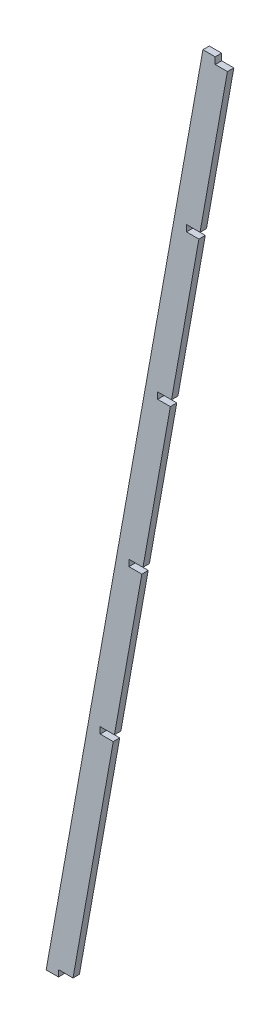
ISO-10303-21;
HEADER;
FILE_DESCRIPTION(('STEP AP214'),'2;1');
FILE_NAME('part.step','',(''),(''),'','','');
FILE_SCHEMA(('AUTOMOTIVE_DESIGN { 1 0 10303 214 1 1 1 1 }'));
ENDSEC;
DATA;
#1=APPLICATION_CONTEXT('core data for automotive mechanical design processes');
#2=APPLICATION_PROTOCOL_DEFINITION('international standard','automotive_design',2000,#1);
#3=PRODUCT_CONTEXT('',#1,'mechanical');
#4=PRODUCT('Part','Part','',(#3));
#5=PRODUCT_RELATED_PRODUCT_CATEGORY('part','',(#4));
#6=PRODUCT_DEFINITION_FORMATION('','',#4);
#7=PRODUCT_DEFINITION_CONTEXT('part definition',#1,'design');
#8=PRODUCT_DEFINITION('design','',#6,#7);
#9=PRODUCT_DEFINITION_SHAPE('','',#8);
#10=(LENGTH_UNIT() NAMED_UNIT(*) SI_UNIT(.MILLI.,.METRE.));
#11=(NAMED_UNIT(*) PLANE_ANGLE_UNIT() SI_UNIT($,.RADIAN.));
#12=(NAMED_UNIT(*) SI_UNIT($,.STERADIAN.) SOLID_ANGLE_UNIT());
#13=UNCERTAINTY_MEASURE_WITH_UNIT(LENGTH_MEASURE(1.E-05),#10,'distance_accuracy_value','');
#14=(GEOMETRIC_REPRESENTATION_CONTEXT(3) GLOBAL_UNCERTAINTY_ASSIGNED_CONTEXT((#13)) GLOBAL_UNIT_ASSIGNED_CONTEXT((#10,
#11,#12)) REPRESENTATION_CONTEXT('',''));
#15=CARTESIAN_POINT('',(0.,0.,0.));
#16=DIRECTION('',(0.,0.,1.));
#17=DIRECTION('',(1.,0.,0.));
#18=AXIS2_PLACEMENT_3D('',#15,#16,#17);
#19=CARTESIAN_POINT('',(12.3053039956114,-2.20382719827451,0.));
#20=DIRECTION('',(-0.984338140304232,0.17629074151074,0.));
#21=DIRECTION('',(-0.17629074151074,-0.984338140304232,0.));
#22=AXIS2_PLACEMENT_3D('',#19,#20,#21);
#23=PLANE('',#22);
#24=DIRECTION('',(0.17629074151074,0.984338140304232,0.));
#25=VECTOR('',#24,1.);
#26=CARTESIAN_POINT('',(12.7,0.,0.));
#27=LINE('',#26,#25);
#28=CARTESIAN_POINT('',(47.8412654139753,196.215,0.));
#29=VERTEX_POINT('',#28);
#30=CARTESIAN_POINT('',(61.3746330005872,271.78,0.));
#31=VERTEX_POINT('',#30);
#32=EDGE_CURVE('E404',#29,#31,#27,.T.);
#33=ORIENTED_EDGE('',*,*,#32,.F.);
#34=DIRECTION('',(0.,0.,1.));
#35=VECTOR('',#34,1.);
#36=CARTESIAN_POINT('',(47.8412654139753,196.215,-5.08));
#37=LINE('',#36,#35);
#38=CARTESIAN_POINT('',(47.8412654139753,196.215,-3.175));
#39=VERTEX_POINT('',#38);
#40=EDGE_CURVE('E631',#39,#29,#37,.T.);
#41=ORIENTED_EDGE('',*,*,#40,.F.);
#42=DIRECTION('',(0.17629074151074,0.984338140304232,0.));
#43=VECTOR('',#42,1.);
#44=CARTESIAN_POINT('',(12.7,0.,-3.175));
#45=LINE('',#44,#43);
#46=CARTESIAN_POINT('',(61.3746330005872,271.78,-3.175));
#47=VERTEX_POINT('',#46);
#48=EDGE_CURVE('E427',#39,#47,#45,.T.);
#49=ORIENTED_EDGE('',*,*,#48,.T.);
#50=DIRECTION('',(0.,0.,1.));
#51=VECTOR('',#50,1.);
#52=CARTESIAN_POINT('',(61.3746330005872,271.78,-5.08));
#53=LINE('',#52,#51);
#54=EDGE_CURVE('E562',#47,#31,#53,.T.);
#55=ORIENTED_EDGE('',*,*,#54,.T.);
#56=EDGE_LOOP('',(#33,#41,#49,#55));
#57=FACE_BOUND('',#56,.T.);
#58=ADVANCED_FACE('F48',(#57),#23,.F.);
#59=CARTESIAN_POINT('',(33.7392689371697,117.475,-3.175));
#60=VERTEX_POINT('',#59);
#61=CARTESIAN_POINT('',(47.2726365237816,193.04,-3.175));
#62=VERTEX_POINT('',#61);
#63=EDGE_CURVE('E419',#60,#62,#45,.T.);
#64=ORIENTED_EDGE('',*,*,#63,.T.);
#65=DIRECTION('',(0.,0.,1.));
#66=VECTOR('',#65,1.);
#67=CARTESIAN_POINT('',(47.2726365237816,193.04,-5.08));
#68=LINE('',#67,#66);
#69=CARTESIAN_POINT('',(47.2726365237816,193.04,0.));
#70=VERTEX_POINT('',#69);
#71=EDGE_CURVE('E655',#62,#70,#68,.T.);
#72=ORIENTED_EDGE('',*,*,#71,.T.);
#73=CARTESIAN_POINT('',(33.7392689371697,117.475,0.));
#74=VERTEX_POINT('',#73);
#75=EDGE_CURVE('E388',#74,#70,#27,.T.);
#76=ORIENTED_EDGE('',*,*,#75,.F.);
#77=DIRECTION('',(0.,0.,1.));
#78=VECTOR('',#77,1.);
#79=CARTESIAN_POINT('',(33.7392689371697,117.475,-5.08));
#80=LINE('',#79,#78);
#81=EDGE_CURVE('E583',#60,#74,#80,.T.);
#82=ORIENTED_EDGE('',*,*,#81,.F.);
#83=EDGE_LOOP('',(#64,#72,#76,#82));
#84=FACE_BOUND('',#83,.T.);
#85=ADVANCED_FACE('F532',(#84),#23,.F.);
#86=CARTESIAN_POINT('',(61.943261890781,274.955,0.));
#87=VERTEX_POINT('',#86);
#88=CARTESIAN_POINT('',(75.4766294773928,350.52,0.));
#89=VERTEX_POINT('',#88);
#90=EDGE_CURVE('E407',#87,#89,#27,.T.);
#91=ORIENTED_EDGE('',*,*,#90,.F.);
#92=DIRECTION('',(0.,0.,1.));
#93=VECTOR('',#92,1.);
#94=CARTESIAN_POINT('',(61.943261890781,274.955,-5.08));
#95=LINE('',#94,#93);
#96=CARTESIAN_POINT('',(61.943261890781,274.955,-3.175));
#97=VERTEX_POINT('',#96);
#98=EDGE_CURVE('E589',#97,#87,#95,.T.);
#99=ORIENTED_EDGE('',*,*,#98,.F.);
#100=CARTESIAN_POINT('',(75.4766294773928,350.52,-3.175));
#101=VERTEX_POINT('',#100);
#102=EDGE_CURVE('E436',#97,#101,#45,.T.);
#103=ORIENTED_EDGE('',*,*,#102,.T.);
#104=DIRECTION('',(0.,0.,1.));
#105=VECTOR('',#104,1.);
#106=CARTESIAN_POINT('',(75.4766294773928,350.52,-5.08));
#107=LINE('',#106,#105);
#108=EDGE_CURVE('E602',#101,#89,#107,.T.);
#109=ORIENTED_EDGE('',*,*,#108,.T.);
#110=EDGE_LOOP('',(#91,#99,#103,#109));
#111=FACE_BOUND('',#110,.T.);
#112=ADVANCED_FACE('F537',(#111),#23,.F.);
#113=CARTESIAN_POINT('',(13.2686288901938,3.17500000000003,0.));
#114=VERTEX_POINT('',#113);
#115=CARTESIAN_POINT('',(33.1706400469759,114.3,0.));
#116=VERTEX_POINT('',#115);
#117=EDGE_CURVE('E382',#114,#116,#27,.T.);
#118=ORIENTED_EDGE('',*,*,#117,.F.);
#119=DIRECTION('',(0.,0.,1.));
#120=VECTOR('',#119,1.);
#121=CARTESIAN_POINT('',(13.2686288901938,3.17500000000003,-5.08));
#122=LINE('',#121,#120);
#123=CARTESIAN_POINT('',(13.2686288901938,3.17500000000003,-3.175));
#124=VERTEX_POINT('',#123);
#125=EDGE_CURVE('E232',#124,#114,#122,.T.);
#126=ORIENTED_EDGE('',*,*,#125,.F.);
#127=CARTESIAN_POINT('',(33.1706400469759,114.3,-3.175));
#128=VERTEX_POINT('',#127);
#129=EDGE_CURVE('E414',#124,#128,#45,.T.);
#130=ORIENTED_EDGE('',*,*,#129,.T.);
#131=DIRECTION('',(0.,0.,1.));
#132=VECTOR('',#131,1.);
#133=CARTESIAN_POINT('',(33.1706400469759,114.3,-5.08));
#134=LINE('',#133,#132);
#135=EDGE_CURVE('E551',#128,#116,#134,.T.);
#136=ORIENTED_EDGE('',*,*,#135,.T.);
#137=EDGE_LOOP('',(#118,#126,#130,#136));
#138=FACE_BOUND('',#137,.T.);
#139=ADVANCED_FACE('F541',(#138),#23,.F.);
#140=CARTESIAN_POINT('',(0.,432.562,0.));
#141=DIRECTION('',(0.,-1.,0.));
#142=DIRECTION('',(0.,0.,-1.));
#143=AXIS2_PLACEMENT_3D('',#140,#141,#142);
#144=PLANE('',#143);
#145=DIRECTION('',(1.,0.,0.));
#146=VECTOR('',#145,1.);
#147=CARTESIAN_POINT('',(77.47,432.562,0.));
#148=LINE('',#147,#146);
#149=CARTESIAN_POINT('',(77.47,432.562,0.));
#150=VERTEX_POINT('',#149);
#151=CARTESIAN_POINT('',(83.5418181672285,432.562,0.));
#152=VERTEX_POINT('',#151);
#153=EDGE_CURVE('E53',#150,#152,#148,.T.);
#154=ORIENTED_EDGE('',*,*,#153,.T.);
#155=DIRECTION('',(0.,0.,1.));
#156=VECTOR('',#155,1.);
#157=CARTESIAN_POINT('',(83.5418181672285,432.562,-5.08));
#158=LINE('',#157,#156);
#159=CARTESIAN_POINT('',(83.5418181672285,432.562,-3.175));
#160=VERTEX_POINT('',#159);
#161=EDGE_CURVE('E212',#160,#152,#158,.T.);
#162=ORIENTED_EDGE('',*,*,#161,.F.);
#163=DIRECTION('',(-1.,0.,0.));
#164=VECTOR('',#163,1.);
#165=CARTESIAN_POINT('',(77.47,432.562,-3.175));
#166=LINE('',#165,#164);
#167=CARTESIAN_POINT('',(77.47,432.562,-3.175));
#168=VERTEX_POINT('',#167);
#169=EDGE_CURVE('E240',#160,#168,#166,.T.);
#170=ORIENTED_EDGE('',*,*,#169,.T.);
#171=DIRECTION('',(0.,0.,1.));
#172=VECTOR('',#171,1.);
#173=CARTESIAN_POINT('',(77.47,432.562,0.));
#174=LINE('',#173,#172);
#175=EDGE_CURVE('E236',#168,#150,#174,.T.);
#176=ORIENTED_EDGE('',*,*,#175,.T.);
#177=EDGE_LOOP('',(#154,#162,#170,#176));
#178=FACE_BOUND('',#177,.T.);
#179=ADVANCED_FACE('F50',(#178),#144,.F.);
#180=CARTESIAN_POINT('',(0.,0.,0.));
#181=DIRECTION('',(0.,-1.,0.));
#182=DIRECTION('',(0.,0.,-1.));
#183=AXIS2_PLACEMENT_3D('',#180,#181,#182);
#184=PLANE('',#183);
#185=DIRECTION('',(0.,0.,1.));
#186=VECTOR('',#185,1.);
#187=CARTESIAN_POINT('',(6.07181816722854,0.,-5.08));
#188=LINE('',#187,#186);
#189=CARTESIAN_POINT('',(6.07181816722854,0.,-3.175));
#190=VERTEX_POINT('',#189);
#191=CARTESIAN_POINT('',(6.07181816722854,0.,0.));
#192=VERTEX_POINT('',#191);
#193=EDGE_CURVE('E464',#190,#192,#188,.T.);
#194=ORIENTED_EDGE('',*,*,#193,.T.);
#195=DIRECTION('',(1.,0.,0.));
#196=VECTOR('',#195,1.);
#197=CARTESIAN_POINT('',(0.,0.,0.));
#198=LINE('',#197,#196);
#199=CARTESIAN_POINT('',(0.,0.,0.));
#200=VERTEX_POINT('',#199);
#201=EDGE_CURVE('E260',#200,#192,#198,.T.);
#202=ORIENTED_EDGE('',*,*,#201,.F.);
#203=DIRECTION('',(0.,0.,1.));
#204=VECTOR('',#203,1.);
#205=CARTESIAN_POINT('',(0.,0.,0.));
#206=LINE('',#205,#204);
#207=CARTESIAN_POINT('',(0.,0.,-3.175));
#208=VERTEX_POINT('',#207);
#209=EDGE_CURVE('E285',#208,#200,#206,.T.);
#210=ORIENTED_EDGE('',*,*,#209,.F.);
#211=DIRECTION('',(-1.,0.,0.));
#212=VECTOR('',#211,1.);
#213=CARTESIAN_POINT('',(0.,0.,-3.175));
#214=LINE('',#213,#212);
#215=EDGE_CURVE('E267',#190,#208,#214,.T.);
#216=ORIENTED_EDGE('',*,*,#215,.F.);
#217=EDGE_LOOP('',(#194,#202,#210,#216));
#218=FACE_BOUND('',#217,.T.);
#219=ADVANCED_FACE('F287',(#218),#184,.T.);
#220=CARTESIAN_POINT('',(76.0452583675866,353.695,-3.175));
#221=VERTEX_POINT('',#220);
#222=CARTESIAN_POINT('',(89.5786259541985,429.26,-3.175));
#223=VERTEX_POINT('',#222);
#224=EDGE_CURVE('E266',#221,#223,#45,.T.);
#225=ORIENTED_EDGE('',*,*,#224,.T.);
#226=DIRECTION('',(0.,0.,1.));
#227=VECTOR('',#226,1.);
#228=CARTESIAN_POINT('',(89.5786259541985,429.26,-5.08));
#229=LINE('',#228,#227);
#230=CARTESIAN_POINT('',(89.5786259541985,429.26,0.));
#231=VERTEX_POINT('',#230);
#232=EDGE_CURVE('E445',#223,#231,#229,.T.);
#233=ORIENTED_EDGE('',*,*,#232,.T.);
#234=CARTESIAN_POINT('',(76.0452583675866,353.695,0.));
#235=VERTEX_POINT('',#234);
#236=EDGE_CURVE('E399',#235,#231,#27,.T.);
#237=ORIENTED_EDGE('',*,*,#236,.F.);
#238=DIRECTION('',(0.,0.,1.));
#239=VECTOR('',#238,1.);
#240=CARTESIAN_POINT('',(76.0452583675866,353.695,-5.08));
#241=LINE('',#240,#239);
#242=EDGE_CURVE('E446',#221,#235,#241,.T.);
#243=ORIENTED_EDGE('',*,*,#242,.F.);
#244=EDGE_LOOP('',(#225,#233,#237,#243));
#245=FACE_BOUND('',#244,.T.);
#246=ADVANCED_FACE('F297',(#245),#23,.F.);
#247=CARTESIAN_POINT('',(0.,0.,0.));
#248=DIRECTION('',(0.,0.,-1.));
#249=DIRECTION('',(-1.,0.,0.));
#250=AXIS2_PLACEMENT_3D('',#247,#248,#249);
#251=PLANE('',#250);
#252=ORIENTED_EDGE('',*,*,#236,.T.);
#253=DIRECTION('',(1.,0.,0.));
#254=VECTOR('',#253,1.);
#255=CARTESIAN_POINT('',(89.5786259541985,429.26,0.));
#256=LINE('',#255,#254);
#257=CARTESIAN_POINT('',(83.5418181672285,429.26,0.));
#258=VERTEX_POINT('',#257);
#259=EDGE_CURVE('E222',#258,#231,#256,.T.);
#260=ORIENTED_EDGE('',*,*,#259,.F.);
#261=DIRECTION('',(0.,-1.,0.));
#262=VECTOR('',#261,1.);
#263=CARTESIAN_POINT('',(83.5418181672285,432.562,0.));
#264=LINE('',#263,#262);
#265=EDGE_CURVE('E215',#152,#258,#264,.T.);
#266=ORIENTED_EDGE('',*,*,#265,.F.);
#267=ORIENTED_EDGE('',*,*,#153,.F.);
#268=DIRECTION('',(0.17629074151074,0.984338140304232,0.));
#269=VECTOR('',#268,1.);
#270=CARTESIAN_POINT('',(0.,0.,0.));
#271=LINE('',#270,#269);
#272=EDGE_CURVE('E471',#200,#150,#271,.T.);
#273=ORIENTED_EDGE('',*,*,#272,.F.);
#274=ORIENTED_EDGE('',*,*,#201,.T.);
#275=DIRECTION('',(0.,-1.,0.));
#276=VECTOR('',#275,1.);
#277=CARTESIAN_POINT('',(6.07181816722855,3.17500000000003,0.));
#278=LINE('',#277,#276);
#279=CARTESIAN_POINT('',(6.07181816722855,3.17500000000003,0.));
#280=VERTEX_POINT('',#279);
#281=EDGE_CURVE('E558',#280,#192,#278,.T.);
#282=ORIENTED_EDGE('',*,*,#281,.F.);
#283=DIRECTION('',(-1.,0.,0.));
#284=VECTOR('',#283,1.);
#285=CARTESIAN_POINT('',(13.2686288901938,3.17500000000003,0.));
#286=LINE('',#285,#284);
#287=EDGE_CURVE('E557',#114,#280,#286,.T.);
#288=ORIENTED_EDGE('',*,*,#287,.F.);
#289=ORIENTED_EDGE('',*,*,#117,.T.);
#290=DIRECTION('',(1.,0.,0.));
#291=VECTOR('',#290,1.);
#292=CARTESIAN_POINT('',(26.6999246761043,114.3,0.));
#293=LINE('',#292,#291);
#294=CARTESIAN_POINT('',(26.6999246761043,114.3,0.));
#295=VERTEX_POINT('',#294);
#296=EDGE_CURVE('E555',#295,#116,#293,.T.);
#297=ORIENTED_EDGE('',*,*,#296,.F.);
#298=DIRECTION('',(0.,-1.,0.));
#299=VECTOR('',#298,1.);
#300=CARTESIAN_POINT('',(26.6999246761043,117.475,0.));
#301=LINE('',#300,#299);
#302=CARTESIAN_POINT('',(26.6999246761043,117.475,0.));
#303=VERTEX_POINT('',#302);
#304=EDGE_CURVE('E610',#303,#295,#301,.T.);
#305=ORIENTED_EDGE('',*,*,#304,.F.);
#306=DIRECTION('',(-1.,0.,0.));
#307=VECTOR('',#306,1.);
#308=CARTESIAN_POINT('',(33.7392689371697,117.475,0.));
#309=LINE('',#308,#307);
#310=EDGE_CURVE('E604',#74,#303,#309,.T.);
#311=ORIENTED_EDGE('',*,*,#310,.F.);
#312=ORIENTED_EDGE('',*,*,#75,.T.);
#313=DIRECTION('',(1.,0.,0.));
#314=VECTOR('',#313,1.);
#315=CARTESIAN_POINT('',(47.2726365237816,193.04,0.));
#316=LINE('',#315,#314);
#317=CARTESIAN_POINT('',(40.9103980488854,193.04,0.));
#318=VERTEX_POINT('',#317);
#319=EDGE_CURVE('E652',#318,#70,#316,.T.);
#320=ORIENTED_EDGE('',*,*,#319,.F.);
#321=DIRECTION('',(0.,-1.,0.));
#322=VECTOR('',#321,1.);
#323=CARTESIAN_POINT('',(40.9103980488854,193.04,0.));
#324=LINE('',#323,#322);
#325=CARTESIAN_POINT('',(40.9103980488854,196.215,0.));
#326=VERTEX_POINT('',#325);
#327=EDGE_CURVE('E662',#326,#318,#324,.T.);
#328=ORIENTED_EDGE('',*,*,#327,.F.);
#329=DIRECTION('',(-1.,0.,0.));
#330=VECTOR('',#329,1.);
#331=CARTESIAN_POINT('',(40.9103980488854,196.215,0.));
#332=LINE('',#331,#330);
#333=EDGE_CURVE('E460',#29,#326,#332,.T.);
#334=ORIENTED_EDGE('',*,*,#333,.F.);
#335=ORIENTED_EDGE('',*,*,#32,.T.);
#336=DIRECTION('',(1.,0.,0.));
#337=VECTOR('',#336,1.);
#338=CARTESIAN_POINT('',(55.1208714216664,271.78,0.));
#339=LINE('',#338,#337);
#340=CARTESIAN_POINT('',(55.1208714216664,271.78,0.));
#341=VERTEX_POINT('',#340);
#342=EDGE_CURVE('E587',#341,#31,#339,.T.);
#343=ORIENTED_EDGE('',*,*,#342,.F.);
#344=DIRECTION('',(0.,-1.,0.));
#345=VECTOR('',#344,1.);
#346=CARTESIAN_POINT('',(55.1208714216664,274.955,0.));
#347=LINE('',#346,#345);
#348=CARTESIAN_POINT('',(55.1208714216664,274.955,0.));
#349=VERTEX_POINT('',#348);
#350=EDGE_CURVE('E582',#349,#341,#347,.T.);
#351=ORIENTED_EDGE('',*,*,#350,.F.);
#352=DIRECTION('',(-1.,0.,0.));
#353=VECTOR('',#352,1.);
#354=CARTESIAN_POINT('',(61.943261890781,274.955,0.));
#355=LINE('',#354,#353);
#356=EDGE_CURVE('E578',#87,#349,#355,.T.);
#357=ORIENTED_EDGE('',*,*,#356,.F.);
#358=ORIENTED_EDGE('',*,*,#90,.T.);
#359=DIRECTION('',(1.,0.,0.));
#360=VECTOR('',#359,1.);
#361=CARTESIAN_POINT('',(69.3313447944475,350.52,0.));
#362=LINE('',#361,#360);
#363=CARTESIAN_POINT('',(69.3313447944475,350.52,0.));
#364=VERTEX_POINT('',#363);
#365=EDGE_CURVE('E615',#364,#89,#362,.T.);
#366=ORIENTED_EDGE('',*,*,#365,.F.);
#367=DIRECTION('',(0.,-1.,0.));
#368=VECTOR('',#367,1.);
#369=CARTESIAN_POINT('',(69.3313447944475,353.695,0.));
#370=LINE('',#369,#368);
#371=CARTESIAN_POINT('',(69.3313447944475,353.695,0.));
#372=VERTEX_POINT('',#371);
#373=EDGE_CURVE('E625',#372,#364,#370,.T.);
#374=ORIENTED_EDGE('',*,*,#373,.F.);
#375=DIRECTION('',(-1.,0.,0.));
#376=VECTOR('',#375,1.);
#377=CARTESIAN_POINT('',(69.3313447944475,353.695,0.));
#378=LINE('',#377,#376);
#379=EDGE_CURVE('E627',#235,#372,#378,.T.);
#380=ORIENTED_EDGE('',*,*,#379,.F.);
#381=EDGE_LOOP('',(#252,#260,#266,#267,#273,#274,#282,#288,#289,#297,#305,#311,#312,#320,#328,
#334,#335,#343,#351,#357,#358,#366,#374,#380));
#382=FACE_BOUND('',#381,.T.);
#383=ADVANCED_FACE('F227',(#382),#251,.F.);
#384=CARTESIAN_POINT('',(0.,0.,-3.175));
#385=DIRECTION('',(0.,0.,1.));
#386=DIRECTION('',(1.,0.,0.));
#387=AXIS2_PLACEMENT_3D('',#384,#385,#386);
#388=PLANE('',#387);
#389=DIRECTION('',(0.,-1.,0.));
#390=VECTOR('',#389,1.);
#391=CARTESIAN_POINT('',(83.5418181672267,-3.51113151303392E-13,-3.175));
#392=LINE('',#391,#390);
#393=CARTESIAN_POINT('',(83.5418181672285,429.26,-3.175));
#394=VERTEX_POINT('',#393);
#395=EDGE_CURVE('E60',#160,#394,#392,.T.);
#396=ORIENTED_EDGE('',*,*,#395,.T.);
#397=DIRECTION('',(1.,0.,0.));
#398=VECTOR('',#397,1.);
#399=CARTESIAN_POINT('',(0.,429.26,-3.175));
#400=LINE('',#399,#398);
#401=EDGE_CURVE('E12',#394,#223,#400,.T.);
#402=ORIENTED_EDGE('',*,*,#401,.T.);
#403=ORIENTED_EDGE('',*,*,#224,.F.);
#404=DIRECTION('',(-1.,0.,0.));
#405=VECTOR('',#404,1.);
#406=CARTESIAN_POINT('',(2.92437732789578E-12,353.695000000001,-3.175));
#407=LINE('',#406,#405);
#408=CARTESIAN_POINT('',(69.3313447944475,353.695,-3.175));
#409=VERTEX_POINT('',#408);
#410=EDGE_CURVE('E239',#221,#409,#407,.T.);
#411=ORIENTED_EDGE('',*,*,#410,.T.);
#412=DIRECTION('',(0.,-1.,0.));
#413=VECTOR('',#412,1.);
#414=CARTESIAN_POINT('',(69.331344794446,-3.03044312279606E-13,-3.175));
#415=LINE('',#414,#413);
#416=CARTESIAN_POINT('',(69.3313447944475,350.52,-3.175));
#417=VERTEX_POINT('',#416);
#418=EDGE_CURVE('E324',#409,#417,#415,.T.);
#419=ORIENTED_EDGE('',*,*,#418,.T.);
#420=DIRECTION('',(1.,0.,0.));
#421=VECTOR('',#420,1.);
#422=CARTESIAN_POINT('',(0.,350.52,-3.175));
#423=LINE('',#422,#421);
#424=EDGE_CURVE('E328',#417,#101,#423,.T.);
#425=ORIENTED_EDGE('',*,*,#424,.T.);
#426=ORIENTED_EDGE('',*,*,#102,.F.);
#427=DIRECTION('',(-1.,0.,0.));
#428=VECTOR('',#427,1.);
#429=CARTESIAN_POINT('',(2.23720243745759E-12,274.955,-3.175));
#430=LINE('',#429,#428);
#431=CARTESIAN_POINT('',(55.1208714216664,274.955,-3.175));
#432=VERTEX_POINT('',#431);
#433=EDGE_CURVE('E344',#97,#432,#430,.T.);
#434=ORIENTED_EDGE('',*,*,#433,.T.);
#435=DIRECTION('',(0.,-1.,0.));
#436=VECTOR('',#435,1.);
#437=CARTESIAN_POINT('',(55.1208714216658,-1.20465473601844E-13,-3.175));
#438=LINE('',#437,#436);
#439=CARTESIAN_POINT('',(55.1208714216664,271.78,-3.175));
#440=VERTEX_POINT('',#439);
#441=EDGE_CURVE('E348',#432,#440,#438,.T.);
#442=ORIENTED_EDGE('',*,*,#441,.T.);
#443=DIRECTION('',(1.,0.,0.));
#444=VECTOR('',#443,1.);
#445=CARTESIAN_POINT('',(0.,271.78,-3.175));
#446=LINE('',#445,#444);
#447=EDGE_CURVE('E352',#440,#47,#446,.T.);
#448=ORIENTED_EDGE('',*,*,#447,.T.);
#449=ORIENTED_EDGE('',*,*,#48,.F.);
#450=DIRECTION('',(-1.,0.,0.));
#451=VECTOR('',#450,1.);
#452=CARTESIAN_POINT('',(7.85768935191555E-13,196.215,-3.175));
#453=LINE('',#452,#451);
#454=CARTESIAN_POINT('',(40.9103980488854,196.215,-3.175));
#455=VERTEX_POINT('',#454);
#456=EDGE_CURVE('E374',#39,#455,#453,.T.);
#457=ORIENTED_EDGE('',*,*,#456,.T.);
#458=DIRECTION('',(0.,-1.,0.));
#459=VECTOR('',#458,1.);
#460=CARTESIAN_POINT('',(40.910398048885,0.,-3.175));
#461=LINE('',#460,#459);
#462=CARTESIAN_POINT('',(40.9103980488854,193.04,-3.175));
#463=VERTEX_POINT('',#462);
#464=EDGE_CURVE('E366',#455,#463,#461,.T.);
#465=ORIENTED_EDGE('',*,*,#464,.T.);
#466=DIRECTION('',(1.,0.,0.));
#467=VECTOR('',#466,1.);
#468=CARTESIAN_POINT('',(8.42146414030548E-13,193.04,-3.175));
#469=LINE('',#468,#467);
#470=EDGE_CURVE('E370',#463,#62,#469,.T.);
#471=ORIENTED_EDGE('',*,*,#470,.T.);
#472=ORIENTED_EDGE('',*,*,#63,.F.);
#473=DIRECTION('',(-1.,0.,0.));
#474=VECTOR('',#473,1.);
#475=CARTESIAN_POINT('',(2.31597299728634E-13,117.475,-3.175));
#476=LINE('',#475,#474);
#477=CARTESIAN_POINT('',(26.6999246761043,117.475,-3.175));
#478=VERTEX_POINT('',#477);
#479=EDGE_CURVE('E340',#60,#478,#476,.T.);
#480=ORIENTED_EDGE('',*,*,#479,.T.);
#481=DIRECTION('',(0.,-1.,0.));
#482=VECTOR('',#481,1.);
#483=CARTESIAN_POINT('',(26.699924676104,0.,-3.175));
#484=LINE('',#483,#482);
#485=CARTESIAN_POINT('',(26.6999246761043,114.3,-3.175));
#486=VERTEX_POINT('',#485);
#487=EDGE_CURVE('E332',#478,#486,#484,.T.);
#488=ORIENTED_EDGE('',*,*,#487,.T.);
#489=DIRECTION('',(1.,0.,0.));
#490=VECTOR('',#489,1.);
#491=CARTESIAN_POINT('',(2.45139996973707E-13,114.3,-3.175));
#492=LINE('',#491,#490);
#493=EDGE_CURVE('E336',#486,#128,#492,.T.);
#494=ORIENTED_EDGE('',*,*,#493,.T.);
#495=ORIENTED_EDGE('',*,*,#129,.F.);
#496=DIRECTION('',(-1.,0.,0.));
#497=VECTOR('',#496,1.);
#498=CARTESIAN_POINT('',(0.,3.17500000000003,-3.175));
#499=LINE('',#498,#497);
#500=CARTESIAN_POINT('',(6.07181816722855,3.17500000000003,-3.175));
#501=VERTEX_POINT('',#500);
#502=EDGE_CURVE('E360',#124,#501,#499,.T.);
#503=ORIENTED_EDGE('',*,*,#502,.T.);
#504=DIRECTION('',(0.,-1.,0.));
#505=VECTOR('',#504,1.);
#506=CARTESIAN_POINT('',(6.07181816722854,0.,-3.175));
#507=LINE('',#506,#505);
#508=EDGE_CURVE('E356',#501,#190,#507,.T.);
#509=ORIENTED_EDGE('',*,*,#508,.T.);
#510=ORIENTED_EDGE('',*,*,#215,.T.);
#511=DIRECTION('',(0.17629074151074,0.984338140304232,0.));
#512=VECTOR('',#511,1.);
#513=CARTESIAN_POINT('',(0.,0.,-3.175));
#514=LINE('',#513,#512);
#515=EDGE_CURVE('E387',#208,#168,#514,.T.);
#516=ORIENTED_EDGE('',*,*,#515,.T.);
#517=ORIENTED_EDGE('',*,*,#169,.F.);
#518=EDGE_LOOP('',(#396,#402,#403,#411,#419,#425,#426,#434,#442,#448,#449,#457,#465,#471,#472,
#480,#488,#494,#495,#503,#509,#510,#516,#517));
#519=FACE_BOUND('',#518,.T.);
#520=ADVANCED_FACE('F448',(#519),#388,.F.);
#521=CARTESIAN_POINT('',(0.,0.,0.));
#522=DIRECTION('',(0.984338140304232,-0.17629074151074,0.));
#523=DIRECTION('',(0.17629074151074,0.984338140304232,0.));
#524=AXIS2_PLACEMENT_3D('',#521,#522,#523);
#525=PLANE('',#524);
#526=ORIENTED_EDGE('',*,*,#272,.T.);
#527=ORIENTED_EDGE('',*,*,#175,.F.);
#528=ORIENTED_EDGE('',*,*,#515,.F.);
#529=ORIENTED_EDGE('',*,*,#209,.T.);
#530=EDGE_LOOP('',(#526,#527,#528,#529));
#531=FACE_BOUND('',#530,.T.);
#532=ADVANCED_FACE('F501',(#531),#525,.F.);
#533=CARTESIAN_POINT('',(69.3313447944475,350.52,-5.08));
#534=DIRECTION('',(0.,-1.,0.));
#535=DIRECTION('',(0.,0.,-1.));
#536=AXIS2_PLACEMENT_3D('',#533,#534,#535);
#537=PLANE('',#536);
#538=DIRECTION('',(0.,0.,1.));
#539=VECTOR('',#538,1.);
#540=CARTESIAN_POINT('',(69.3313447944475,350.52,-5.08));
#541=LINE('',#540,#539);
#542=EDGE_CURVE('E605',#417,#364,#541,.T.);
#543=ORIENTED_EDGE('',*,*,#542,.T.);
#544=ORIENTED_EDGE('',*,*,#365,.T.);
#545=ORIENTED_EDGE('',*,*,#108,.F.);
#546=ORIENTED_EDGE('',*,*,#424,.F.);
#547=EDGE_LOOP('',(#543,#544,#545,#546));
#548=FACE_BOUND('',#547,.T.);
#549=ADVANCED_FACE('F520',(#548),#537,.F.);
#550=CARTESIAN_POINT('',(69.3313447944475,353.695,-5.08));
#551=DIRECTION('',(-1.,0.,0.));
#552=DIRECTION('',(0.,-1.,0.));
#553=AXIS2_PLACEMENT_3D('',#550,#551,#552);
#554=PLANE('',#553);
#555=DIRECTION('',(0.,0.,1.));
#556=VECTOR('',#555,1.);
#557=CARTESIAN_POINT('',(69.3313447944475,353.695,-5.08));
#558=LINE('',#557,#556);
#559=EDGE_CURVE('E612',#409,#372,#558,.T.);
#560=ORIENTED_EDGE('',*,*,#559,.T.);
#561=ORIENTED_EDGE('',*,*,#373,.T.);
#562=ORIENTED_EDGE('',*,*,#542,.F.);
#563=ORIENTED_EDGE('',*,*,#418,.F.);
#564=EDGE_LOOP('',(#560,#561,#562,#563));
#565=FACE_BOUND('',#564,.T.);
#566=ADVANCED_FACE('F527',(#565),#554,.F.);
#567=CARTESIAN_POINT('',(69.3313447944475,353.695,-5.08));
#568=DIRECTION('',(0.,1.,0.));
#569=DIRECTION('',(-1.,0.,0.));
#570=AXIS2_PLACEMENT_3D('',#567,#568,#569);
#571=PLANE('',#570);
#572=ORIENTED_EDGE('',*,*,#242,.T.);
#573=ORIENTED_EDGE('',*,*,#379,.T.);
#574=ORIENTED_EDGE('',*,*,#559,.F.);
#575=ORIENTED_EDGE('',*,*,#410,.F.);
#576=EDGE_LOOP('',(#572,#573,#574,#575));
#577=FACE_BOUND('',#576,.T.);
#578=ADVANCED_FACE('F706',(#577),#571,.F.);
#579=CARTESIAN_POINT('',(33.7392689371697,117.475,-5.08));
#580=DIRECTION('',(0.,1.,0.));
#581=DIRECTION('',(-1.,0.,0.));
#582=AXIS2_PLACEMENT_3D('',#579,#580,#581);
#583=PLANE('',#582);
#584=ORIENTED_EDGE('',*,*,#81,.T.);
#585=ORIENTED_EDGE('',*,*,#310,.T.);
#586=DIRECTION('',(0.,0.,1.));
#587=VECTOR('',#586,1.);
#588=CARTESIAN_POINT('',(26.6999246761043,117.475,-5.08));
#589=LINE('',#588,#587);
#590=EDGE_CURVE('E634',#478,#303,#589,.T.);
#591=ORIENTED_EDGE('',*,*,#590,.F.);
#592=ORIENTED_EDGE('',*,*,#479,.F.);
#593=EDGE_LOOP('',(#584,#585,#591,#592));
#594=FACE_BOUND('',#593,.T.);
#595=ADVANCED_FACE('F699',(#594),#583,.F.);
#596=CARTESIAN_POINT('',(26.6999246761043,114.3,-5.08));
#597=DIRECTION('',(0.,-1.,0.));
#598=DIRECTION('',(1.,0.,0.));
#599=AXIS2_PLACEMENT_3D('',#596,#597,#598);
#600=PLANE('',#599);
#601=DIRECTION('',(0.,0.,1.));
#602=VECTOR('',#601,1.);
#603=CARTESIAN_POINT('',(26.6999246761043,114.3,-5.08));
#604=LINE('',#603,#602);
#605=EDGE_CURVE('E637',#486,#295,#604,.T.);
#606=ORIENTED_EDGE('',*,*,#605,.T.);
#607=ORIENTED_EDGE('',*,*,#296,.T.);
#608=ORIENTED_EDGE('',*,*,#135,.F.);
#609=ORIENTED_EDGE('',*,*,#493,.F.);
#610=EDGE_LOOP('',(#606,#607,#608,#609));
#611=FACE_BOUND('',#610,.T.);
#612=ADVANCED_FACE('F695',(#611),#600,.F.);
#613=CARTESIAN_POINT('',(26.6999246761043,117.475,-5.08));
#614=DIRECTION('',(-1.,0.,0.));
#615=DIRECTION('',(0.,-1.,0.));
#616=AXIS2_PLACEMENT_3D('',#613,#614,#615);
#617=PLANE('',#616);
#618=ORIENTED_EDGE('',*,*,#590,.T.);
#619=ORIENTED_EDGE('',*,*,#304,.T.);
#620=ORIENTED_EDGE('',*,*,#605,.F.);
#621=ORIENTED_EDGE('',*,*,#487,.F.);
#622=EDGE_LOOP('',(#618,#619,#620,#621));
#623=FACE_BOUND('',#622,.T.);
#624=ADVANCED_FACE('F698',(#623),#617,.F.);
#625=CARTESIAN_POINT('',(55.1208714216664,271.78,-5.08));
#626=DIRECTION('',(0.,-1.,0.));
#627=DIRECTION('',(0.,0.,-1.));
#628=AXIS2_PLACEMENT_3D('',#625,#626,#627);
#629=PLANE('',#628);
#630=DIRECTION('',(0.,0.,1.));
#631=VECTOR('',#630,1.);
#632=CARTESIAN_POINT('',(55.1208714216664,271.78,-5.08));
#633=LINE('',#632,#631);
#634=EDGE_CURVE('E568',#440,#341,#633,.T.);
#635=ORIENTED_EDGE('',*,*,#634,.T.);
#636=ORIENTED_EDGE('',*,*,#342,.T.);
#637=ORIENTED_EDGE('',*,*,#54,.F.);
#638=ORIENTED_EDGE('',*,*,#447,.F.);
#639=EDGE_LOOP('',(#635,#636,#637,#638));
#640=FACE_BOUND('',#639,.T.);
#641=ADVANCED_FACE('F703',(#640),#629,.F.);
#642=CARTESIAN_POINT('',(55.1208714216664,274.955,-5.08));
#643=DIRECTION('',(-1.,0.,0.));
#644=DIRECTION('',(0.,-1.,0.));
#645=AXIS2_PLACEMENT_3D('',#642,#643,#644);
#646=PLANE('',#645);
#647=DIRECTION('',(0.,0.,1.));
#648=VECTOR('',#647,1.);
#649=CARTESIAN_POINT('',(55.1208714216664,274.955,-5.08));
#650=LINE('',#649,#648);
#651=EDGE_CURVE('E593',#432,#349,#650,.T.);
#652=ORIENTED_EDGE('',*,*,#651,.T.);
#653=ORIENTED_EDGE('',*,*,#350,.T.);
#654=ORIENTED_EDGE('',*,*,#634,.F.);
#655=ORIENTED_EDGE('',*,*,#441,.F.);
#656=EDGE_LOOP('',(#652,#653,#654,#655));
#657=FACE_BOUND('',#656,.T.);
#658=ADVANCED_FACE('F720',(#657),#646,.F.);
#659=CARTESIAN_POINT('',(61.943261890781,274.955,-5.08));
#660=DIRECTION('',(0.,1.,0.));
#661=DIRECTION('',(-1.,0.,0.));
#662=AXIS2_PLACEMENT_3D('',#659,#660,#661);
#663=PLANE('',#662);
#664=ORIENTED_EDGE('',*,*,#98,.T.);
#665=ORIENTED_EDGE('',*,*,#356,.T.);
#666=ORIENTED_EDGE('',*,*,#651,.F.);
#667=ORIENTED_EDGE('',*,*,#433,.F.);
#668=EDGE_LOOP('',(#664,#665,#666,#667));
#669=FACE_BOUND('',#668,.T.);
#670=ADVANCED_FACE('F298',(#669),#663,.F.);
#671=CARTESIAN_POINT('',(13.2686288901938,3.17500000000003,-5.08));
#672=DIRECTION('',(0.,1.,0.));
#673=DIRECTION('',(0.,0.,1.));
#674=AXIS2_PLACEMENT_3D('',#671,#672,#673);
#675=PLANE('',#674);
#676=ORIENTED_EDGE('',*,*,#125,.T.);
#677=ORIENTED_EDGE('',*,*,#287,.T.);
#678=DIRECTION('',(0.,0.,1.));
#679=VECTOR('',#678,1.);
#680=CARTESIAN_POINT('',(6.07181816722855,3.17500000000003,-5.08));
#681=LINE('',#680,#679);
#682=EDGE_CURVE('E566',#501,#280,#681,.T.);
#683=ORIENTED_EDGE('',*,*,#682,.F.);
#684=ORIENTED_EDGE('',*,*,#502,.F.);
#685=EDGE_LOOP('',(#676,#677,#683,#684));
#686=FACE_BOUND('',#685,.T.);
#687=ADVANCED_FACE('F715',(#686),#675,.F.);
#688=CARTESIAN_POINT('',(6.07181816722855,3.17500000000003,-5.08));
#689=DIRECTION('',(-1.,0.,0.));
#690=DIRECTION('',(0.,-1.,0.));
#691=AXIS2_PLACEMENT_3D('',#688,#689,#690);
#692=PLANE('',#691);
#693=ORIENTED_EDGE('',*,*,#682,.T.);
#694=ORIENTED_EDGE('',*,*,#281,.T.);
#695=ORIENTED_EDGE('',*,*,#193,.F.);
#696=ORIENTED_EDGE('',*,*,#508,.F.);
#697=EDGE_LOOP('',(#693,#694,#695,#696));
#698=FACE_BOUND('',#697,.T.);
#699=ADVANCED_FACE('F694',(#698),#692,.F.);
#700=CARTESIAN_POINT('',(40.9103980488854,196.215,-5.08));
#701=DIRECTION('',(0.,1.,0.));
#702=DIRECTION('',(-1.,0.,0.));
#703=AXIS2_PLACEMENT_3D('',#700,#701,#702);
#704=PLANE('',#703);
#705=ORIENTED_EDGE('',*,*,#40,.T.);
#706=ORIENTED_EDGE('',*,*,#333,.T.);
#707=DIRECTION('',(0.,0.,1.));
#708=VECTOR('',#707,1.);
#709=CARTESIAN_POINT('',(40.9103980488854,196.215,-5.08));
#710=LINE('',#709,#708);
#711=EDGE_CURVE('E649',#455,#326,#710,.T.);
#712=ORIENTED_EDGE('',*,*,#711,.F.);
#713=ORIENTED_EDGE('',*,*,#456,.F.);
#714=EDGE_LOOP('',(#705,#706,#712,#713));
#715=FACE_BOUND('',#714,.T.);
#716=ADVANCED_FACE('F671',(#715),#704,.F.);
#717=CARTESIAN_POINT('',(47.2726365237816,193.04,-5.08));
#718=DIRECTION('',(0.,-1.,0.));
#719=DIRECTION('',(1.,0.,0.));
#720=AXIS2_PLACEMENT_3D('',#717,#718,#719);
#721=PLANE('',#720);
#722=DIRECTION('',(0.,0.,1.));
#723=VECTOR('',#722,1.);
#724=CARTESIAN_POINT('',(40.9103980488854,193.04,-5.08));
#725=LINE('',#724,#723);
#726=EDGE_CURVE('E76',#463,#318,#725,.T.);
#727=ORIENTED_EDGE('',*,*,#726,.T.);
#728=ORIENTED_EDGE('',*,*,#319,.T.);
#729=ORIENTED_EDGE('',*,*,#71,.F.);
#730=ORIENTED_EDGE('',*,*,#470,.F.);
#731=EDGE_LOOP('',(#727,#728,#729,#730));
#732=FACE_BOUND('',#731,.T.);
#733=ADVANCED_FACE('F677',(#732),#721,.F.);
#734=CARTESIAN_POINT('',(40.9103980488854,193.04,-5.08));
#735=DIRECTION('',(-1.,0.,0.));
#736=DIRECTION('',(0.,-1.,0.));
#737=AXIS2_PLACEMENT_3D('',#734,#735,#736);
#738=PLANE('',#737);
#739=ORIENTED_EDGE('',*,*,#711,.T.);
#740=ORIENTED_EDGE('',*,*,#327,.T.);
#741=ORIENTED_EDGE('',*,*,#726,.F.);
#742=ORIENTED_EDGE('',*,*,#464,.F.);
#743=EDGE_LOOP('',(#739,#740,#741,#742));
#744=FACE_BOUND('',#743,.T.);
#745=ADVANCED_FACE('F681',(#744),#738,.F.);
#746=CARTESIAN_POINT('',(89.5786259541985,429.26,-5.08));
#747=DIRECTION('',(0.,-1.,0.));
#748=DIRECTION('',(0.,0.,-1.));
#749=AXIS2_PLACEMENT_3D('',#746,#747,#748);
#750=PLANE('',#749);
#751=DIRECTION('',(0.,0.,1.));
#752=VECTOR('',#751,1.);
#753=CARTESIAN_POINT('',(83.5418181672285,429.26,-5.08));
#754=LINE('',#753,#752);
#755=EDGE_CURVE('E68',#394,#258,#754,.T.);
#756=ORIENTED_EDGE('',*,*,#755,.T.);
#757=ORIENTED_EDGE('',*,*,#259,.T.);
#758=ORIENTED_EDGE('',*,*,#232,.F.);
#759=ORIENTED_EDGE('',*,*,#401,.F.);
#760=EDGE_LOOP('',(#756,#757,#758,#759));
#761=FACE_BOUND('',#760,.T.);
#762=ADVANCED_FACE('F450',(#761),#750,.F.);
#763=CARTESIAN_POINT('',(83.5418181672285,432.562,-5.08));
#764=DIRECTION('',(-1.,0.,0.));
#765=DIRECTION('',(0.,-1.,0.));
#766=AXIS2_PLACEMENT_3D('',#763,#764,#765);
#767=PLANE('',#766);
#768=ORIENTED_EDGE('',*,*,#161,.T.);
#769=ORIENTED_EDGE('',*,*,#265,.T.);
#770=ORIENTED_EDGE('',*,*,#755,.F.);
#771=ORIENTED_EDGE('',*,*,#395,.F.);
#772=EDGE_LOOP('',(#768,#769,#770,#771));
#773=FACE_BOUND('',#772,.T.);
#774=ADVANCED_FACE('F214',(#773),#767,.F.);
#775=CLOSED_SHELL('',(#58,#85,#112,#139,#179,#219,#246,#383,#520,#532,#549,#566,#578,#595,#612,
#624,#641,#658,#670,#687,#699,#716,#733,#745,#762,#774));
#776=MANIFOLD_SOLID_BREP('B2',#775);
#777=ADVANCED_BREP_SHAPE_REPRESENTATION('',(#18,#776),#14);
#778=SHAPE_DEFINITION_REPRESENTATION(#9,#777);
ENDSEC;
END-ISO-10303-21;
